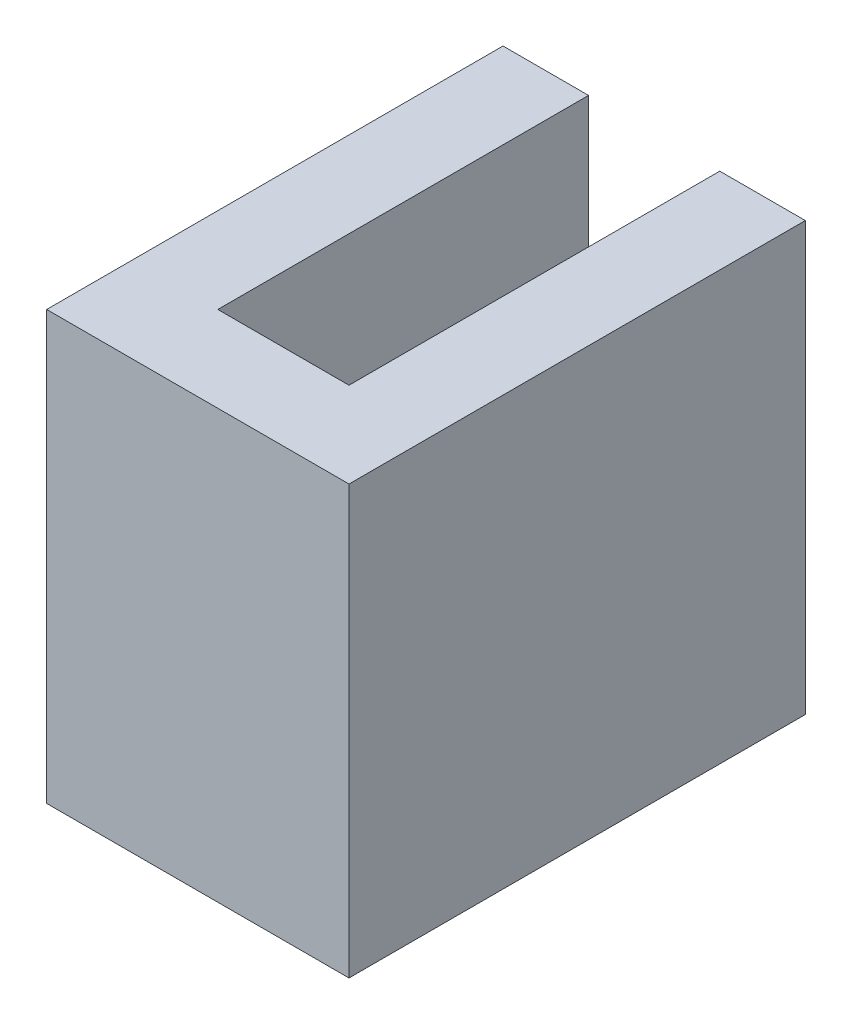
ISO-10303-21;
HEADER;
FILE_DESCRIPTION(('STEP AP214'),'2;1');
FILE_NAME('part.step','',(''),(''),'','','');
FILE_SCHEMA(('AUTOMOTIVE_DESIGN { 1 0 10303 214 1 1 1 1 }'));
ENDSEC;
DATA;
#1=APPLICATION_CONTEXT('core data for automotive mechanical design processes');
#2=APPLICATION_PROTOCOL_DEFINITION('international standard','automotive_design',2000,#1);
#3=PRODUCT_CONTEXT('',#1,'mechanical');
#4=PRODUCT('Part','Part','',(#3));
#5=PRODUCT_RELATED_PRODUCT_CATEGORY('part','',(#4));
#6=PRODUCT_DEFINITION_FORMATION('','',#4);
#7=PRODUCT_DEFINITION_CONTEXT('part definition',#1,'design');
#8=PRODUCT_DEFINITION('design','',#6,#7);
#9=PRODUCT_DEFINITION_SHAPE('','',#8);
#10=(LENGTH_UNIT() NAMED_UNIT(*) SI_UNIT(.MILLI.,.METRE.));
#11=(NAMED_UNIT(*) PLANE_ANGLE_UNIT() SI_UNIT($,.RADIAN.));
#12=(NAMED_UNIT(*) SI_UNIT($,.STERADIAN.) SOLID_ANGLE_UNIT());
#13=UNCERTAINTY_MEASURE_WITH_UNIT(LENGTH_MEASURE(1.E-05),#10,'distance_accuracy_value','');
#14=(GEOMETRIC_REPRESENTATION_CONTEXT(3) GLOBAL_UNCERTAINTY_ASSIGNED_CONTEXT((#13)) GLOBAL_UNIT_ASSIGNED_CONTEXT((#10,
#11,#12)) REPRESENTATION_CONTEXT('',''));
#15=CARTESIAN_POINT('',(0.,0.,0.));
#16=DIRECTION('',(0.,0.,1.));
#17=DIRECTION('',(1.,0.,0.));
#18=AXIS2_PLACEMENT_3D('',#15,#16,#17);
#19=CARTESIAN_POINT('',(10.6,15.,0.));
#20=DIRECTION('',(0.,0.,-1.));
#21=DIRECTION('',(-1.,0.,0.));
#22=AXIS2_PLACEMENT_3D('',#19,#20,#21);
#23=PLANE('',#22);
#24=DIRECTION('',(1.,0.,0.));
#25=VECTOR('',#24,1.);
#26=CARTESIAN_POINT('',(10.6,0.,0.));
#27=LINE('',#26,#25);
#28=CARTESIAN_POINT('',(0.,0.,0.));
#29=VERTEX_POINT('',#28);
#30=CARTESIAN_POINT('',(10.6,0.,0.));
#31=VERTEX_POINT('',#30);
#32=EDGE_CURVE('E140',#29,#31,#27,.T.);
#33=ORIENTED_EDGE('',*,*,#32,.T.);
#34=DIRECTION('',(0.,-1.,0.));
#35=VECTOR('',#34,1.);
#36=CARTESIAN_POINT('',(10.6,15.,0.));
#37=LINE('',#36,#35);
#38=CARTESIAN_POINT('',(10.6,15.,0.));
#39=VERTEX_POINT('',#38);
#40=EDGE_CURVE('E11',#39,#31,#37,.T.);
#41=ORIENTED_EDGE('',*,*,#40,.F.);
#42=DIRECTION('',(1.,0.,0.));
#43=VECTOR('',#42,1.);
#44=CARTESIAN_POINT('',(10.6,15.,0.));
#45=LINE('',#44,#43);
#46=CARTESIAN_POINT('',(0.,15.,0.));
#47=VERTEX_POINT('',#46);
#48=EDGE_CURVE('E162',#47,#39,#45,.T.);
#49=ORIENTED_EDGE('',*,*,#48,.F.);
#50=DIRECTION('',(0.,-1.,0.));
#51=VECTOR('',#50,1.);
#52=CARTESIAN_POINT('',(0.,15.,0.));
#53=LINE('',#52,#51);
#54=EDGE_CURVE('E136',#47,#29,#53,.T.);
#55=ORIENTED_EDGE('',*,*,#54,.T.);
#56=EDGE_LOOP('',(#33,#41,#49,#55));
#57=FACE_BOUND('',#56,.T.);
#58=ADVANCED_FACE('F39',(#57),#23,.F.);
#59=CARTESIAN_POINT('',(10.6,15.,-16.));
#60=DIRECTION('',(-1.,0.,0.));
#61=DIRECTION('',(0.,0.,1.));
#62=AXIS2_PLACEMENT_3D('',#59,#60,#61);
#63=PLANE('',#62);
#64=DIRECTION('',(0.,0.,-1.));
#65=VECTOR('',#64,1.);
#66=CARTESIAN_POINT('',(10.6,0.,-16.));
#67=LINE('',#66,#65);
#68=CARTESIAN_POINT('',(10.6,0.,-16.));
#69=VERTEX_POINT('',#68);
#70=EDGE_CURVE('E144',#31,#69,#67,.T.);
#71=ORIENTED_EDGE('',*,*,#70,.T.);
#72=DIRECTION('',(0.,-1.,0.));
#73=VECTOR('',#72,1.);
#74=CARTESIAN_POINT('',(10.6,15.,-16.));
#75=LINE('',#74,#73);
#76=CARTESIAN_POINT('',(10.6,15.,-16.));
#77=VERTEX_POINT('',#76);
#78=EDGE_CURVE('E48',#77,#69,#75,.T.);
#79=ORIENTED_EDGE('',*,*,#78,.F.);
#80=DIRECTION('',(0.,0.,-1.));
#81=VECTOR('',#80,1.);
#82=CARTESIAN_POINT('',(10.6,15.,-16.));
#83=LINE('',#82,#81);
#84=EDGE_CURVE('E99',#39,#77,#83,.T.);
#85=ORIENTED_EDGE('',*,*,#84,.F.);
#86=ORIENTED_EDGE('',*,*,#40,.T.);
#87=EDGE_LOOP('',(#71,#79,#85,#86));
#88=FACE_BOUND('',#87,.T.);
#89=ADVANCED_FACE('F208',(#88),#63,.F.);
#90=CARTESIAN_POINT('',(7.6,15.,-16.));
#91=DIRECTION('',(0.,0.,1.));
#92=DIRECTION('',(1.,0.,0.));
#93=AXIS2_PLACEMENT_3D('',#90,#91,#92);
#94=PLANE('',#93);
#95=DIRECTION('',(-1.,0.,0.));
#96=VECTOR('',#95,1.);
#97=CARTESIAN_POINT('',(7.6,0.,-16.));
#98=LINE('',#97,#96);
#99=CARTESIAN_POINT('',(7.6,0.,-16.));
#100=VERTEX_POINT('',#99);
#101=EDGE_CURVE('E147',#69,#100,#98,.T.);
#102=ORIENTED_EDGE('',*,*,#101,.T.);
#103=DIRECTION('',(0.,-1.,0.));
#104=VECTOR('',#103,1.);
#105=CARTESIAN_POINT('',(7.6,15.,-16.));
#106=LINE('',#105,#104);
#107=CARTESIAN_POINT('',(7.6,15.,-16.));
#108=VERTEX_POINT('',#107);
#109=EDGE_CURVE('E173',#108,#100,#106,.T.);
#110=ORIENTED_EDGE('',*,*,#109,.F.);
#111=DIRECTION('',(-1.,0.,0.));
#112=VECTOR('',#111,1.);
#113=CARTESIAN_POINT('',(7.6,15.,-16.));
#114=LINE('',#113,#112);
#115=EDGE_CURVE('E183',#77,#108,#114,.T.);
#116=ORIENTED_EDGE('',*,*,#115,.F.);
#117=ORIENTED_EDGE('',*,*,#78,.T.);
#118=EDGE_LOOP('',(#102,#110,#116,#117));
#119=FACE_BOUND('',#118,.T.);
#120=ADVANCED_FACE('F181',(#119),#94,.F.);
#121=CARTESIAN_POINT('',(7.6,15.,-3.));
#122=DIRECTION('',(1.,0.,0.));
#123=DIRECTION('',(0.,0.,-1.));
#124=AXIS2_PLACEMENT_3D('',#121,#122,#123);
#125=PLANE('',#124);
#126=DIRECTION('',(0.,0.,1.));
#127=VECTOR('',#126,1.);
#128=CARTESIAN_POINT('',(7.6,0.,-3.));
#129=LINE('',#128,#127);
#130=CARTESIAN_POINT('',(7.6,0.,-3.));
#131=VERTEX_POINT('',#130);
#132=EDGE_CURVE('E150',#100,#131,#129,.T.);
#133=ORIENTED_EDGE('',*,*,#132,.T.);
#134=DIRECTION('',(0.,-1.,0.));
#135=VECTOR('',#134,1.);
#136=CARTESIAN_POINT('',(7.6,15.,-3.));
#137=LINE('',#136,#135);
#138=CARTESIAN_POINT('',(7.6,15.,-3.));
#139=VERTEX_POINT('',#138);
#140=EDGE_CURVE('E169',#139,#131,#137,.T.);
#141=ORIENTED_EDGE('',*,*,#140,.F.);
#142=DIRECTION('',(0.,0.,1.));
#143=VECTOR('',#142,1.);
#144=CARTESIAN_POINT('',(7.6,15.,-3.));
#145=LINE('',#144,#143);
#146=EDGE_CURVE('E196',#108,#139,#145,.T.);
#147=ORIENTED_EDGE('',*,*,#146,.F.);
#148=ORIENTED_EDGE('',*,*,#109,.T.);
#149=EDGE_LOOP('',(#133,#141,#147,#148));
#150=FACE_BOUND('',#149,.T.);
#151=ADVANCED_FACE('F191',(#150),#125,.F.);
#152=CARTESIAN_POINT('',(3.,15.,-3.));
#153=DIRECTION('',(0.,0.,1.));
#154=DIRECTION('',(1.,0.,0.));
#155=AXIS2_PLACEMENT_3D('',#152,#153,#154);
#156=PLANE('',#155);
#157=DIRECTION('',(-1.,0.,0.));
#158=VECTOR('',#157,1.);
#159=CARTESIAN_POINT('',(3.,0.,-3.));
#160=LINE('',#159,#158);
#161=CARTESIAN_POINT('',(3.,0.,-3.));
#162=VERTEX_POINT('',#161);
#163=EDGE_CURVE('E153',#131,#162,#160,.T.);
#164=ORIENTED_EDGE('',*,*,#163,.T.);
#165=DIRECTION('',(0.,-1.,0.));
#166=VECTOR('',#165,1.);
#167=CARTESIAN_POINT('',(3.,15.,-3.));
#168=LINE('',#167,#166);
#169=CARTESIAN_POINT('',(3.,15.,-3.));
#170=VERTEX_POINT('',#169);
#171=EDGE_CURVE('E129',#170,#162,#168,.T.);
#172=ORIENTED_EDGE('',*,*,#171,.F.);
#173=DIRECTION('',(-1.,0.,0.));
#174=VECTOR('',#173,1.);
#175=CARTESIAN_POINT('',(3.,15.,-3.));
#176=LINE('',#175,#174);
#177=EDGE_CURVE('E118',#139,#170,#176,.T.);
#178=ORIENTED_EDGE('',*,*,#177,.F.);
#179=ORIENTED_EDGE('',*,*,#140,.T.);
#180=EDGE_LOOP('',(#164,#172,#178,#179));
#181=FACE_BOUND('',#180,.T.);
#182=ADVANCED_FACE('F194',(#181),#156,.F.);
#183=CARTESIAN_POINT('',(3.,15.,-16.));
#184=DIRECTION('',(-1.,0.,0.));
#185=DIRECTION('',(0.,0.,1.));
#186=AXIS2_PLACEMENT_3D('',#183,#184,#185);
#187=PLANE('',#186);
#188=DIRECTION('',(0.,0.,-1.));
#189=VECTOR('',#188,1.);
#190=CARTESIAN_POINT('',(3.,0.,-16.));
#191=LINE('',#190,#189);
#192=CARTESIAN_POINT('',(3.,0.,-16.));
#193=VERTEX_POINT('',#192);
#194=EDGE_CURVE('E127',#162,#193,#191,.T.);
#195=ORIENTED_EDGE('',*,*,#194,.T.);
#196=DIRECTION('',(0.,-1.,0.));
#197=VECTOR('',#196,1.);
#198=CARTESIAN_POINT('',(3.,15.,-16.));
#199=LINE('',#198,#197);
#200=CARTESIAN_POINT('',(3.,15.,-16.));
#201=VERTEX_POINT('',#200);
#202=EDGE_CURVE('E124',#201,#193,#199,.T.);
#203=ORIENTED_EDGE('',*,*,#202,.F.);
#204=DIRECTION('',(0.,0.,-1.));
#205=VECTOR('',#204,1.);
#206=CARTESIAN_POINT('',(3.,15.,-16.));
#207=LINE('',#206,#205);
#208=EDGE_CURVE('E112',#170,#201,#207,.T.);
#209=ORIENTED_EDGE('',*,*,#208,.F.);
#210=ORIENTED_EDGE('',*,*,#171,.T.);
#211=EDGE_LOOP('',(#195,#203,#209,#210));
#212=FACE_BOUND('',#211,.T.);
#213=ADVANCED_FACE('F125',(#212),#187,.F.);
#214=CARTESIAN_POINT('',(0.,15.,-16.));
#215=DIRECTION('',(0.,0.,1.));
#216=DIRECTION('',(1.,0.,0.));
#217=AXIS2_PLACEMENT_3D('',#214,#215,#216);
#218=PLANE('',#217);
#219=DIRECTION('',(-1.,0.,0.));
#220=VECTOR('',#219,1.);
#221=CARTESIAN_POINT('',(0.,0.,-16.));
#222=LINE('',#221,#220);
#223=CARTESIAN_POINT('',(0.,0.,-16.));
#224=VERTEX_POINT('',#223);
#225=EDGE_CURVE('E85',#193,#224,#222,.T.);
#226=ORIENTED_EDGE('',*,*,#225,.T.);
#227=DIRECTION('',(0.,-1.,0.));
#228=VECTOR('',#227,1.);
#229=CARTESIAN_POINT('',(0.,15.,-16.));
#230=LINE('',#229,#228);
#231=CARTESIAN_POINT('',(0.,15.,-16.));
#232=VERTEX_POINT('',#231);
#233=EDGE_CURVE('E130',#232,#224,#230,.T.);
#234=ORIENTED_EDGE('',*,*,#233,.F.);
#235=DIRECTION('',(-1.,0.,0.));
#236=VECTOR('',#235,1.);
#237=CARTESIAN_POINT('',(0.,15.,-16.));
#238=LINE('',#237,#236);
#239=EDGE_CURVE('E116',#201,#232,#238,.T.);
#240=ORIENTED_EDGE('',*,*,#239,.F.);
#241=ORIENTED_EDGE('',*,*,#202,.T.);
#242=EDGE_LOOP('',(#226,#234,#240,#241));
#243=FACE_BOUND('',#242,.T.);
#244=ADVANCED_FACE('F132',(#243),#218,.F.);
#245=CARTESIAN_POINT('',(0.,15.,0.));
#246=DIRECTION('',(1.,0.,0.));
#247=DIRECTION('',(0.,0.,-1.));
#248=AXIS2_PLACEMENT_3D('',#245,#246,#247);
#249=PLANE('',#248);
#250=DIRECTION('',(0.,0.,1.));
#251=VECTOR('',#250,1.);
#252=CARTESIAN_POINT('',(0.,0.,0.));
#253=LINE('',#252,#251);
#254=EDGE_CURVE('E91',#224,#29,#253,.T.);
#255=ORIENTED_EDGE('',*,*,#254,.T.);
#256=ORIENTED_EDGE('',*,*,#54,.F.);
#257=DIRECTION('',(0.,0.,1.));
#258=VECTOR('',#257,1.);
#259=CARTESIAN_POINT('',(0.,15.,0.));
#260=LINE('',#259,#258);
#261=EDGE_CURVE('E56',#232,#47,#260,.T.);
#262=ORIENTED_EDGE('',*,*,#261,.F.);
#263=ORIENTED_EDGE('',*,*,#233,.T.);
#264=EDGE_LOOP('',(#255,#256,#262,#263));
#265=FACE_BOUND('',#264,.T.);
#266=ADVANCED_FACE('F224',(#265),#249,.F.);
#267=CARTESIAN_POINT('',(0.,15.,0.));
#268=DIRECTION('',(0.,-1.,0.));
#269=DIRECTION('',(0.,0.,-1.));
#270=AXIS2_PLACEMENT_3D('',#267,#268,#269);
#271=PLANE('',#270);
#272=ORIENTED_EDGE('',*,*,#48,.T.);
#273=ORIENTED_EDGE('',*,*,#84,.T.);
#274=ORIENTED_EDGE('',*,*,#115,.T.);
#275=ORIENTED_EDGE('',*,*,#146,.T.);
#276=ORIENTED_EDGE('',*,*,#177,.T.);
#277=ORIENTED_EDGE('',*,*,#208,.T.);
#278=ORIENTED_EDGE('',*,*,#239,.T.);
#279=ORIENTED_EDGE('',*,*,#261,.T.);
#280=EDGE_LOOP('',(#272,#273,#274,#275,#276,#277,#278,#279));
#281=FACE_BOUND('',#280,.T.);
#282=ADVANCED_FACE('F114',(#281),#271,.F.);
#283=CARTESIAN_POINT('',(0.,0.,0.));
#284=DIRECTION('',(0.,-1.,0.));
#285=DIRECTION('',(0.,0.,-1.));
#286=AXIS2_PLACEMENT_3D('',#283,#284,#285);
#287=PLANE('',#286);
#288=ORIENTED_EDGE('',*,*,#32,.F.);
#289=ORIENTED_EDGE('',*,*,#254,.F.);
#290=ORIENTED_EDGE('',*,*,#225,.F.);
#291=ORIENTED_EDGE('',*,*,#194,.F.);
#292=ORIENTED_EDGE('',*,*,#163,.F.);
#293=ORIENTED_EDGE('',*,*,#132,.F.);
#294=ORIENTED_EDGE('',*,*,#101,.F.);
#295=ORIENTED_EDGE('',*,*,#70,.F.);
#296=EDGE_LOOP('',(#288,#289,#290,#291,#292,#293,#294,#295));
#297=FACE_BOUND('',#296,.T.);
#298=ADVANCED_FACE('F187',(#297),#287,.T.);
#299=CLOSED_SHELL('',(#58,#89,#120,#151,#182,#213,#244,#266,#282,#298));
#300=MANIFOLD_SOLID_BREP('B2',#299);
#301=ADVANCED_BREP_SHAPE_REPRESENTATION('',(#18,#300),#14);
#302=SHAPE_DEFINITION_REPRESENTATION(#9,#301);
ENDSEC;
END-ISO-10303-21;
